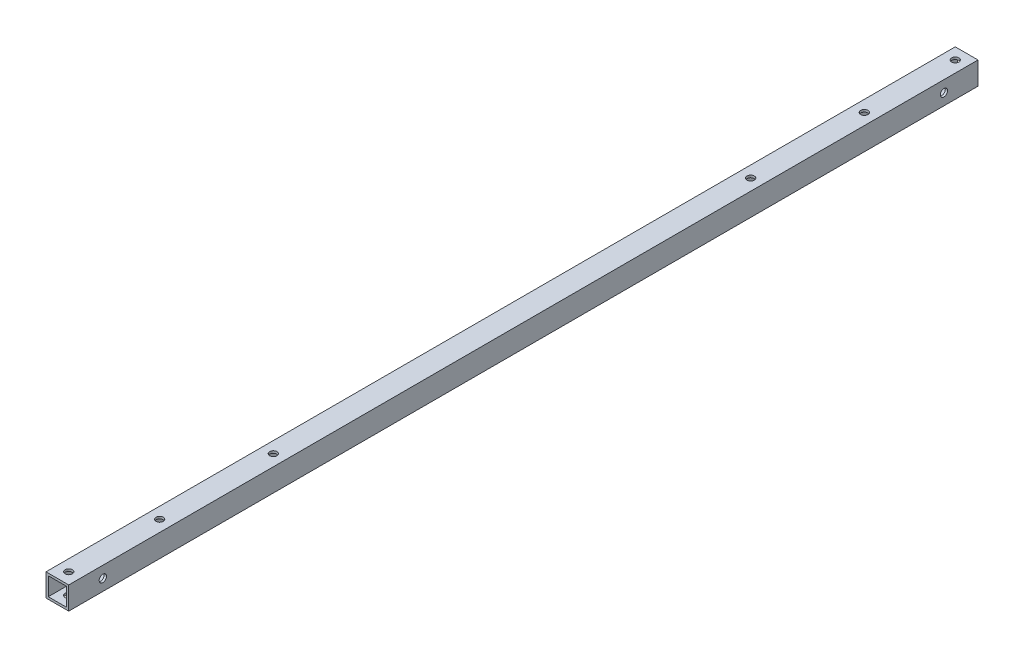
ISO-10303-21;
HEADER;
FILE_DESCRIPTION(('STEP AP214'),'2;1');
FILE_NAME('part.step','',(''),(''),'','','');
FILE_SCHEMA(('AUTOMOTIVE_DESIGN { 1 0 10303 214 1 1 1 1 }'));
ENDSEC;
DATA;
#1=APPLICATION_CONTEXT('core data for automotive mechanical design processes');
#2=APPLICATION_PROTOCOL_DEFINITION('international standard','automotive_design',2000,#1);
#3=PRODUCT_CONTEXT('',#1,'mechanical');
#4=PRODUCT('Part','Part','',(#3));
#5=PRODUCT_RELATED_PRODUCT_CATEGORY('part','',(#4));
#6=PRODUCT_DEFINITION_FORMATION('','',#4);
#7=PRODUCT_DEFINITION_CONTEXT('part definition',#1,'design');
#8=PRODUCT_DEFINITION('design','',#6,#7);
#9=PRODUCT_DEFINITION_SHAPE('','',#8);
#10=(LENGTH_UNIT() NAMED_UNIT(*) SI_UNIT(.MILLI.,.METRE.));
#11=(NAMED_UNIT(*) PLANE_ANGLE_UNIT() SI_UNIT($,.RADIAN.));
#12=(NAMED_UNIT(*) SI_UNIT($,.STERADIAN.) SOLID_ANGLE_UNIT());
#13=UNCERTAINTY_MEASURE_WITH_UNIT(LENGTH_MEASURE(1.E-05),#10,'distance_accuracy_value','');
#14=(GEOMETRIC_REPRESENTATION_CONTEXT(3) GLOBAL_UNCERTAINTY_ASSIGNED_CONTEXT((#13)) GLOBAL_UNIT_ASSIGNED_CONTEXT((#10,
#11,#12)) REPRESENTATION_CONTEXT('',''));
#15=CARTESIAN_POINT('',(0.,0.,0.));
#16=DIRECTION('',(0.,0.,1.));
#17=DIRECTION('',(1.,0.,0.));
#18=AXIS2_PLACEMENT_3D('',#15,#16,#17);
#19=CARTESIAN_POINT('',(0.,0.,400.));
#20=DIRECTION('',(0.,0.,1.));
#21=DIRECTION('',(1.,0.,0.));
#22=AXIS2_PLACEMENT_3D('',#19,#20,#21);
#23=PLANE('',#22);
#24=DIRECTION('',(0.,1.,0.));
#25=VECTOR('',#24,1.);
#26=CARTESIAN_POINT('',(5.00000000000002,-4.99999999999998,400.));
#27=LINE('',#26,#25);
#28=CARTESIAN_POINT('',(5.00000000000002,-4.99999999999998,400.));
#29=VERTEX_POINT('',#28);
#30=CARTESIAN_POINT('',(5.00000000000002,5.,400.));
#31=VERTEX_POINT('',#30);
#32=EDGE_CURVE('E161',#29,#31,#27,.T.);
#33=ORIENTED_EDGE('',*,*,#32,.T.);
#34=DIRECTION('',(-1.,0.,0.));
#35=VECTOR('',#34,1.);
#36=CARTESIAN_POINT('',(-4.99999999999998,5.,400.));
#37=LINE('',#36,#35);
#38=CARTESIAN_POINT('',(-4.99999999999998,5.,400.));
#39=VERTEX_POINT('',#38);
#40=EDGE_CURVE('E164',#31,#39,#37,.T.);
#41=ORIENTED_EDGE('',*,*,#40,.T.);
#42=DIRECTION('',(0.,-1.,0.));
#43=VECTOR('',#42,1.);
#44=CARTESIAN_POINT('',(-4.99999999999998,-4.99999999999998,400.));
#45=LINE('',#44,#43);
#46=CARTESIAN_POINT('',(-4.99999999999998,-4.99999999999998,400.));
#47=VERTEX_POINT('',#46);
#48=EDGE_CURVE('E167',#39,#47,#45,.T.);
#49=ORIENTED_EDGE('',*,*,#48,.T.);
#50=DIRECTION('',(1.,0.,0.));
#51=VECTOR('',#50,1.);
#52=CARTESIAN_POINT('',(-4.99999999999998,-4.99999999999998,400.));
#53=LINE('',#52,#51);
#54=EDGE_CURVE('E169',#47,#29,#53,.T.);
#55=ORIENTED_EDGE('',*,*,#54,.T.);
#56=EDGE_LOOP('',(#33,#41,#49,#55));
#57=FACE_BOUND('',#56,.T.);
#58=DIRECTION('',(-1.,0.,0.));
#59=VECTOR('',#58,1.);
#60=CARTESIAN_POINT('',(0.,4.,400.));
#61=LINE('',#60,#59);
#62=CARTESIAN_POINT('',(4.00000000000002,4.,400.));
#63=VERTEX_POINT('',#62);
#64=CARTESIAN_POINT('',(-3.99999999999998,4.,400.));
#65=VERTEX_POINT('',#64);
#66=EDGE_CURVE('E131',#63,#65,#61,.T.);
#67=ORIENTED_EDGE('',*,*,#66,.F.);
#68=DIRECTION('',(0.,1.,0.));
#69=VECTOR('',#68,1.);
#70=CARTESIAN_POINT('',(4.00000000000002,0.,400.));
#71=LINE('',#70,#69);
#72=CARTESIAN_POINT('',(4.00000000000002,-3.99999999999998,400.));
#73=VERTEX_POINT('',#72);
#74=EDGE_CURVE('E123',#73,#63,#71,.T.);
#75=ORIENTED_EDGE('',*,*,#74,.F.);
#76=DIRECTION('',(1.,0.,0.));
#77=VECTOR('',#76,1.);
#78=CARTESIAN_POINT('',(0.,-3.99999999999998,400.));
#79=LINE('',#78,#77);
#80=CARTESIAN_POINT('',(-3.99999999999998,-3.99999999999998,400.));
#81=VERTEX_POINT('',#80);
#82=EDGE_CURVE('E145',#81,#73,#79,.T.);
#83=ORIENTED_EDGE('',*,*,#82,.F.);
#84=DIRECTION('',(0.,-1.,0.));
#85=VECTOR('',#84,1.);
#86=CARTESIAN_POINT('',(-3.99999999999998,0.,400.));
#87=LINE('',#86,#85);
#88=EDGE_CURVE('E143',#65,#81,#87,.T.);
#89=ORIENTED_EDGE('',*,*,#88,.F.);
#90=EDGE_LOOP('',(#67,#75,#83,#89));
#91=FACE_BOUND('',#90,.T.);
#92=ADVANCED_FACE('F56',(#57,#91),#23,.T.);
#93=CARTESIAN_POINT('',(0.,0.,0.));
#94=DIRECTION('',(0.,0.,1.));
#95=DIRECTION('',(1.,0.,0.));
#96=AXIS2_PLACEMENT_3D('',#93,#94,#95);
#97=PLANE('',#96);
#98=DIRECTION('',(0.,1.,0.));
#99=VECTOR('',#98,1.);
#100=CARTESIAN_POINT('',(5.00000000000002,-4.99999999999998,0.));
#101=LINE('',#100,#99);
#102=CARTESIAN_POINT('',(5.00000000000002,-4.99999999999998,0.));
#103=VERTEX_POINT('',#102);
#104=CARTESIAN_POINT('',(5.00000000000002,5.,0.));
#105=VERTEX_POINT('',#104);
#106=EDGE_CURVE('E139',#103,#105,#101,.T.);
#107=ORIENTED_EDGE('',*,*,#106,.F.);
#108=DIRECTION('',(1.,0.,0.));
#109=VECTOR('',#108,1.);
#110=CARTESIAN_POINT('',(-4.99999999999998,-4.99999999999998,0.));
#111=LINE('',#110,#109);
#112=CARTESIAN_POINT('',(-4.99999999999998,-4.99999999999998,0.));
#113=VERTEX_POINT('',#112);
#114=EDGE_CURVE('E165',#113,#103,#111,.T.);
#115=ORIENTED_EDGE('',*,*,#114,.F.);
#116=DIRECTION('',(0.,-1.,0.));
#117=VECTOR('',#116,1.);
#118=CARTESIAN_POINT('',(-4.99999999999998,-4.99999999999998,0.));
#119=LINE('',#118,#117);
#120=CARTESIAN_POINT('',(-4.99999999999998,5.,0.));
#121=VERTEX_POINT('',#120);
#122=EDGE_CURVE('E176',#121,#113,#119,.T.);
#123=ORIENTED_EDGE('',*,*,#122,.F.);
#124=DIRECTION('',(-1.,0.,0.));
#125=VECTOR('',#124,1.);
#126=CARTESIAN_POINT('',(-4.99999999999998,5.,0.));
#127=LINE('',#126,#125);
#128=EDGE_CURVE('E174',#105,#121,#127,.T.);
#129=ORIENTED_EDGE('',*,*,#128,.F.);
#130=EDGE_LOOP('',(#107,#115,#123,#129));
#131=FACE_BOUND('',#130,.T.);
#132=DIRECTION('',(0.,1.,0.));
#133=VECTOR('',#132,1.);
#134=CARTESIAN_POINT('',(4.00000000000002,0.,0.));
#135=LINE('',#134,#133);
#136=CARTESIAN_POINT('',(4.00000000000002,-3.99999999999998,0.));
#137=VERTEX_POINT('',#136);
#138=CARTESIAN_POINT('',(4.00000000000002,4.,0.));
#139=VERTEX_POINT('',#138);
#140=EDGE_CURVE('E81',#137,#139,#135,.T.);
#141=ORIENTED_EDGE('',*,*,#140,.T.);
#142=DIRECTION('',(-1.,0.,0.));
#143=VECTOR('',#142,1.);
#144=CARTESIAN_POINT('',(0.,4.,0.));
#145=LINE('',#144,#143);
#146=CARTESIAN_POINT('',(-3.99999999999998,4.,0.));
#147=VERTEX_POINT('',#146);
#148=EDGE_CURVE('E138',#139,#147,#145,.T.);
#149=ORIENTED_EDGE('',*,*,#148,.T.);
#150=DIRECTION('',(0.,-1.,0.));
#151=VECTOR('',#150,1.);
#152=CARTESIAN_POINT('',(-3.99999999999998,0.,0.));
#153=LINE('',#152,#151);
#154=CARTESIAN_POINT('',(-3.99999999999998,-3.99999999999998,0.));
#155=VERTEX_POINT('',#154);
#156=EDGE_CURVE('E153',#147,#155,#153,.T.);
#157=ORIENTED_EDGE('',*,*,#156,.T.);
#158=DIRECTION('',(1.,0.,0.));
#159=VECTOR('',#158,1.);
#160=CARTESIAN_POINT('',(0.,-3.99999999999998,0.));
#161=LINE('',#160,#159);
#162=EDGE_CURVE('E132',#155,#137,#161,.T.);
#163=ORIENTED_EDGE('',*,*,#162,.T.);
#164=EDGE_LOOP('',(#141,#149,#157,#163));
#165=FACE_BOUND('',#164,.T.);
#166=ADVANCED_FACE('F321',(#131,#165),#97,.F.);
#167=CARTESIAN_POINT('',(5.00000000000002,-4.99999999999998,400.));
#168=DIRECTION('',(-1.,0.,0.));
#169=DIRECTION('',(0.,0.,1.));
#170=AXIS2_PLACEMENT_3D('',#167,#168,#169);
#171=PLANE('',#170);
#172=CARTESIAN_POINT('',(5.00000000000002,0.,385.));
#173=DIRECTION('',(1.,0.,0.));
#174=DIRECTION('',(0.,0.,-1.));
#175=AXIS2_PLACEMENT_3D('',#172,#173,#174);
#176=CIRCLE('',#175,1.59999999999996);
#177=CARTESIAN_POINT('',(5.00000000000002,0.,383.4));
#178=VERTEX_POINT('',#177);
#179=EDGE_CURVE('E218',#178,#178,#176,.T.);
#180=ORIENTED_EDGE('',*,*,#179,.F.);
#181=EDGE_LOOP('',(#180));
#182=FACE_BOUND('',#181,.T.);
#183=CARTESIAN_POINT('',(5.00000000000002,0.,15.));
#184=DIRECTION('',(1.,0.,0.));
#185=DIRECTION('',(0.,0.,1.));
#186=AXIS2_PLACEMENT_3D('',#183,#184,#185);
#187=CIRCLE('',#186,1.60000000000001);
#188=CARTESIAN_POINT('',(5.00000000000002,0.,16.6));
#189=VERTEX_POINT('',#188);
#190=EDGE_CURVE('E228',#189,#189,#187,.T.);
#191=ORIENTED_EDGE('',*,*,#190,.F.);
#192=EDGE_LOOP('',(#191));
#193=FACE_BOUND('',#192,.T.);
#194=ORIENTED_EDGE('',*,*,#106,.T.);
#195=DIRECTION('',(0.,0.,-1.));
#196=VECTOR('',#195,1.);
#197=CARTESIAN_POINT('',(5.00000000000002,5.,400.));
#198=LINE('',#197,#196);
#199=EDGE_CURVE('E12',#31,#105,#198,.T.);
#200=ORIENTED_EDGE('',*,*,#199,.F.);
#201=ORIENTED_EDGE('',*,*,#32,.F.);
#202=DIRECTION('',(0.,0.,-1.));
#203=VECTOR('',#202,1.);
#204=CARTESIAN_POINT('',(5.00000000000002,-4.99999999999998,400.));
#205=LINE('',#204,#203);
#206=EDGE_CURVE('E171',#29,#103,#205,.T.);
#207=ORIENTED_EDGE('',*,*,#206,.T.);
#208=EDGE_LOOP('',(#194,#200,#201,#207));
#209=FACE_BOUND('',#208,.T.);
#210=ADVANCED_FACE('F58',(#182,#193,#209),#171,.F.);
#211=CARTESIAN_POINT('',(-4.99999999999998,5.,400.));
#212=DIRECTION('',(0.,-1.,0.));
#213=DIRECTION('',(0.,0.,-1.));
#214=AXIS2_PLACEMENT_3D('',#211,#212,#213);
#215=PLANE('',#214);
#216=CARTESIAN_POINT('',(0.,5.,5.));
#217=DIRECTION('',(0.,1.,0.));
#218=DIRECTION('',(0.,0.,-1.));
#219=AXIS2_PLACEMENT_3D('',#216,#217,#218);
#220=CIRCLE('',#219,1.6);
#221=CARTESIAN_POINT('',(0.,5.,3.40000000000001));
#222=VERTEX_POINT('',#221);
#223=EDGE_CURVE('E234',#222,#222,#220,.T.);
#224=ORIENTED_EDGE('',*,*,#223,.F.);
#225=EDGE_LOOP('',(#224));
#226=FACE_BOUND('',#225,.T.);
#227=CARTESIAN_POINT('',(0.,5.,45.));
#228=DIRECTION('',(0.,1.,0.));
#229=DIRECTION('',(0.,0.,-1.));
#230=AXIS2_PLACEMENT_3D('',#227,#228,#229);
#231=CIRCLE('',#230,1.6);
#232=CARTESIAN_POINT('',(0.,5.,43.4));
#233=VERTEX_POINT('',#232);
#234=EDGE_CURVE('E253',#233,#233,#231,.T.);
#235=ORIENTED_EDGE('',*,*,#234,.F.);
#236=EDGE_LOOP('',(#235));
#237=FACE_BOUND('',#236,.T.);
#238=CARTESIAN_POINT('',(0.,5.,305.));
#239=DIRECTION('',(0.,1.,0.));
#240=DIRECTION('',(0.,0.,1.));
#241=AXIS2_PLACEMENT_3D('',#238,#239,#240);
#242=CIRCLE('',#241,1.59999999999999);
#243=CARTESIAN_POINT('',(0.,5.,306.6));
#244=VERTEX_POINT('',#243);
#245=EDGE_CURVE('E238',#244,#244,#242,.T.);
#246=ORIENTED_EDGE('',*,*,#245,.F.);
#247=EDGE_LOOP('',(#246));
#248=FACE_BOUND('',#247,.T.);
#249=CARTESIAN_POINT('',(0.,5.,95.));
#250=DIRECTION('',(0.,1.,0.));
#251=DIRECTION('',(0.,0.,-1.));
#252=AXIS2_PLACEMENT_3D('',#249,#250,#251);
#253=CIRCLE('',#252,1.6);
#254=CARTESIAN_POINT('',(0.,5.,93.4));
#255=VERTEX_POINT('',#254);
#256=EDGE_CURVE('E239',#255,#255,#253,.T.);
#257=ORIENTED_EDGE('',*,*,#256,.F.);
#258=EDGE_LOOP('',(#257));
#259=FACE_BOUND('',#258,.T.);
#260=CARTESIAN_POINT('',(0.,5.,395.));
#261=DIRECTION('',(0.,1.,0.));
#262=DIRECTION('',(0.,0.,1.));
#263=AXIS2_PLACEMENT_3D('',#260,#261,#262);
#264=CIRCLE('',#263,1.6);
#265=CARTESIAN_POINT('',(0.,5.,396.6));
#266=VERTEX_POINT('',#265);
#267=EDGE_CURVE('E245',#266,#266,#264,.T.);
#268=ORIENTED_EDGE('',*,*,#267,.F.);
#269=EDGE_LOOP('',(#268));
#270=FACE_BOUND('',#269,.T.);
#271=CARTESIAN_POINT('',(0.,5.,355.));
#272=DIRECTION('',(0.,1.,0.));
#273=DIRECTION('',(0.,0.,1.));
#274=AXIS2_PLACEMENT_3D('',#271,#272,#273);
#275=CIRCLE('',#274,1.59999999999999);
#276=CARTESIAN_POINT('',(0.,5.,356.6));
#277=VERTEX_POINT('',#276);
#278=EDGE_CURVE('E252',#277,#277,#275,.T.);
#279=ORIENTED_EDGE('',*,*,#278,.F.);
#280=EDGE_LOOP('',(#279));
#281=FACE_BOUND('',#280,.T.);
#282=ORIENTED_EDGE('',*,*,#128,.T.);
#283=DIRECTION('',(0.,0.,-1.));
#284=VECTOR('',#283,1.);
#285=CARTESIAN_POINT('',(-4.99999999999998,5.,400.));
#286=LINE('',#285,#284);
#287=EDGE_CURVE('E65',#39,#121,#286,.T.);
#288=ORIENTED_EDGE('',*,*,#287,.F.);
#289=ORIENTED_EDGE('',*,*,#40,.F.);
#290=ORIENTED_EDGE('',*,*,#199,.T.);
#291=EDGE_LOOP('',(#282,#288,#289,#290));
#292=FACE_BOUND('',#291,.T.);
#293=ADVANCED_FACE('F307',(#226,#237,#248,#259,#270,#281,#292),#215,.F.);
#294=CARTESIAN_POINT('',(-4.99999999999998,-4.99999999999998,400.));
#295=DIRECTION('',(1.,0.,0.));
#296=DIRECTION('',(0.,0.,-1.));
#297=AXIS2_PLACEMENT_3D('',#294,#295,#296);
#298=PLANE('',#297);
#299=CARTESIAN_POINT('',(-4.99999999999998,0.,385.));
#300=DIRECTION('',(1.,0.,0.));
#301=DIRECTION('',(0.,0.,-1.));
#302=AXIS2_PLACEMENT_3D('',#299,#300,#301);
#303=CIRCLE('',#302,1.59999999999996);
#304=CARTESIAN_POINT('',(-4.99999999999998,0.,383.4));
#305=VERTEX_POINT('',#304);
#306=EDGE_CURVE('E212',#305,#305,#303,.T.);
#307=ORIENTED_EDGE('',*,*,#306,.T.);
#308=EDGE_LOOP('',(#307));
#309=FACE_BOUND('',#308,.T.);
#310=CARTESIAN_POINT('',(-4.99999999999998,0.,15.));
#311=DIRECTION('',(1.,0.,0.));
#312=DIRECTION('',(0.,0.,1.));
#313=AXIS2_PLACEMENT_3D('',#310,#311,#312);
#314=CIRCLE('',#313,1.60000000000001);
#315=CARTESIAN_POINT('',(-4.99999999999998,0.,16.6));
#316=VERTEX_POINT('',#315);
#317=EDGE_CURVE('E223',#316,#316,#314,.T.);
#318=ORIENTED_EDGE('',*,*,#317,.T.);
#319=EDGE_LOOP('',(#318));
#320=FACE_BOUND('',#319,.T.);
#321=ORIENTED_EDGE('',*,*,#122,.T.);
#322=DIRECTION('',(0.,0.,-1.));
#323=VECTOR('',#322,1.);
#324=CARTESIAN_POINT('',(-4.99999999999998,-4.99999999999998,400.));
#325=LINE('',#324,#323);
#326=EDGE_CURVE('E181',#47,#113,#325,.T.);
#327=ORIENTED_EDGE('',*,*,#326,.F.);
#328=ORIENTED_EDGE('',*,*,#48,.F.);
#329=ORIENTED_EDGE('',*,*,#287,.T.);
#330=EDGE_LOOP('',(#321,#327,#328,#329));
#331=FACE_BOUND('',#330,.T.);
#332=ADVANCED_FACE('F310',(#309,#320,#331),#298,.F.);
#333=CARTESIAN_POINT('',(-4.99999999999998,-4.99999999999998,400.));
#334=DIRECTION('',(0.,1.,0.));
#335=DIRECTION('',(0.,0.,1.));
#336=AXIS2_PLACEMENT_3D('',#333,#334,#335);
#337=PLANE('',#336);
#338=CARTESIAN_POINT('',(0.,-4.99999999999998,5.));
#339=DIRECTION('',(0.,1.,0.));
#340=DIRECTION('',(0.,0.,-1.));
#341=AXIS2_PLACEMENT_3D('',#338,#339,#340);
#342=CIRCLE('',#341,1.6);
#343=CARTESIAN_POINT('',(0.,-4.99999999999998,3.40000000000001));
#344=VERTEX_POINT('',#343);
#345=EDGE_CURVE('E248',#344,#344,#342,.T.);
#346=ORIENTED_EDGE('',*,*,#345,.T.);
#347=EDGE_LOOP('',(#346));
#348=FACE_BOUND('',#347,.T.);
#349=CARTESIAN_POINT('',(0.,-4.99999999999998,45.));
#350=DIRECTION('',(0.,1.,0.));
#351=DIRECTION('',(0.,0.,-1.));
#352=AXIS2_PLACEMENT_3D('',#349,#350,#351);
#353=CIRCLE('',#352,1.6);
#354=CARTESIAN_POINT('',(0.,-4.99999999999998,43.4));
#355=VERTEX_POINT('',#354);
#356=EDGE_CURVE('E249',#355,#355,#353,.T.);
#357=ORIENTED_EDGE('',*,*,#356,.T.);
#358=EDGE_LOOP('',(#357));
#359=FACE_BOUND('',#358,.T.);
#360=CARTESIAN_POINT('',(0.,-4.99999999999998,305.));
#361=DIRECTION('',(0.,1.,0.));
#362=DIRECTION('',(0.,0.,1.));
#363=AXIS2_PLACEMENT_3D('',#360,#361,#362);
#364=CIRCLE('',#363,1.59999999999999);
#365=CARTESIAN_POINT('',(0.,-4.99999999999998,306.6));
#366=VERTEX_POINT('',#365);
#367=EDGE_CURVE('E256',#366,#366,#364,.T.);
#368=ORIENTED_EDGE('',*,*,#367,.T.);
#369=EDGE_LOOP('',(#368));
#370=FACE_BOUND('',#369,.T.);
#371=CARTESIAN_POINT('',(0.,-4.99999999999998,95.));
#372=DIRECTION('',(0.,1.,0.));
#373=DIRECTION('',(0.,0.,-1.));
#374=AXIS2_PLACEMENT_3D('',#371,#372,#373);
#375=CIRCLE('',#374,1.6);
#376=CARTESIAN_POINT('',(0.,-4.99999999999998,93.4));
#377=VERTEX_POINT('',#376);
#378=EDGE_CURVE('E235',#377,#377,#375,.T.);
#379=ORIENTED_EDGE('',*,*,#378,.T.);
#380=EDGE_LOOP('',(#379));
#381=FACE_BOUND('',#380,.T.);
#382=CARTESIAN_POINT('',(0.,-4.99999999999998,395.));
#383=DIRECTION('',(0.,1.,0.));
#384=DIRECTION('',(0.,0.,1.));
#385=AXIS2_PLACEMENT_3D('',#382,#383,#384);
#386=CIRCLE('',#385,1.6);
#387=CARTESIAN_POINT('',(0.,-4.99999999999998,396.6));
#388=VERTEX_POINT('',#387);
#389=EDGE_CURVE('E242',#388,#388,#386,.T.);
#390=ORIENTED_EDGE('',*,*,#389,.T.);
#391=EDGE_LOOP('',(#390));
#392=FACE_BOUND('',#391,.T.);
#393=CARTESIAN_POINT('',(0.,-4.99999999999998,355.));
#394=DIRECTION('',(0.,1.,0.));
#395=DIRECTION('',(0.,0.,1.));
#396=AXIS2_PLACEMENT_3D('',#393,#394,#395);
#397=CIRCLE('',#396,1.59999999999999);
#398=CARTESIAN_POINT('',(0.,-4.99999999999998,356.6));
#399=VERTEX_POINT('',#398);
#400=EDGE_CURVE('E190',#399,#399,#397,.T.);
#401=ORIENTED_EDGE('',*,*,#400,.T.);
#402=EDGE_LOOP('',(#401));
#403=FACE_BOUND('',#402,.T.);
#404=ORIENTED_EDGE('',*,*,#114,.T.);
#405=ORIENTED_EDGE('',*,*,#206,.F.);
#406=ORIENTED_EDGE('',*,*,#54,.F.);
#407=ORIENTED_EDGE('',*,*,#326,.T.);
#408=EDGE_LOOP('',(#404,#405,#406,#407));
#409=FACE_BOUND('',#408,.T.);
#410=ADVANCED_FACE('F325',(#348,#359,#370,#381,#392,#403,#409),#337,.F.);
#411=CARTESIAN_POINT('',(4.00000000000002,0.,400.));
#412=DIRECTION('',(-1.,0.,0.));
#413=DIRECTION('',(0.,0.,1.));
#414=AXIS2_PLACEMENT_3D('',#411,#412,#413);
#415=PLANE('',#414);
#416=CARTESIAN_POINT('',(4.00000000000002,0.,385.));
#417=DIRECTION('',(-1.,0.,0.));
#418=DIRECTION('',(0.,0.,1.));
#419=AXIS2_PLACEMENT_3D('',#416,#417,#418);
#420=CIRCLE('',#419,1.59999999999996);
#421=CARTESIAN_POINT('',(4.00000000000002,0.,386.6));
#422=VERTEX_POINT('',#421);
#423=EDGE_CURVE('E231',#422,#422,#420,.T.);
#424=ORIENTED_EDGE('',*,*,#423,.F.);
#425=EDGE_LOOP('',(#424));
#426=FACE_BOUND('',#425,.T.);
#427=CARTESIAN_POINT('',(4.00000000000002,0.,15.));
#428=DIRECTION('',(-1.,0.,0.));
#429=DIRECTION('',(0.,0.,1.));
#430=AXIS2_PLACEMENT_3D('',#427,#428,#429);
#431=CIRCLE('',#430,1.60000000000001);
#432=CARTESIAN_POINT('',(4.00000000000002,0.,16.6));
#433=VERTEX_POINT('',#432);
#434=EDGE_CURVE('E211',#433,#433,#431,.T.);
#435=ORIENTED_EDGE('',*,*,#434,.F.);
#436=EDGE_LOOP('',(#435));
#437=FACE_BOUND('',#436,.T.);
#438=ORIENTED_EDGE('',*,*,#140,.F.);
#439=DIRECTION('',(0.,0.,-1.));
#440=VECTOR('',#439,1.);
#441=CARTESIAN_POINT('',(4.00000000000002,-3.99999999999998,400.));
#442=LINE('',#441,#440);
#443=EDGE_CURVE('E127',#73,#137,#442,.T.);
#444=ORIENTED_EDGE('',*,*,#443,.F.);
#445=ORIENTED_EDGE('',*,*,#74,.T.);
#446=DIRECTION('',(0.,0.,-1.));
#447=VECTOR('',#446,1.);
#448=CARTESIAN_POINT('',(4.00000000000002,4.,400.));
#449=LINE('',#448,#447);
#450=EDGE_CURVE('E126',#63,#139,#449,.T.);
#451=ORIENTED_EDGE('',*,*,#450,.T.);
#452=EDGE_LOOP('',(#438,#444,#445,#451));
#453=FACE_BOUND('',#452,.T.);
#454=ADVANCED_FACE('F125',(#426,#437,#453),#415,.T.);
#455=CARTESIAN_POINT('',(0.,4.,400.));
#456=DIRECTION('',(0.,-1.,0.));
#457=DIRECTION('',(0.,0.,-1.));
#458=AXIS2_PLACEMENT_3D('',#455,#456,#457);
#459=PLANE('',#458);
#460=CARTESIAN_POINT('',(0.,4.,5.));
#461=DIRECTION('',(0.,-1.,0.));
#462=DIRECTION('',(0.,0.,-1.));
#463=AXIS2_PLACEMENT_3D('',#460,#461,#462);
#464=CIRCLE('',#463,1.6);
#465=CARTESIAN_POINT('',(0.,4.,3.40000000000001));
#466=VERTEX_POINT('',#465);
#467=EDGE_CURVE('E151',#466,#466,#464,.T.);
#468=ORIENTED_EDGE('',*,*,#467,.F.);
#469=EDGE_LOOP('',(#468));
#470=FACE_BOUND('',#469,.T.);
#471=CARTESIAN_POINT('',(0.,4.,45.));
#472=DIRECTION('',(0.,-1.,0.));
#473=DIRECTION('',(0.,0.,-1.));
#474=AXIS2_PLACEMENT_3D('',#471,#472,#473);
#475=CIRCLE('',#474,1.6);
#476=CARTESIAN_POINT('',(0.,4.,43.4));
#477=VERTEX_POINT('',#476);
#478=EDGE_CURVE('E206',#477,#477,#475,.T.);
#479=ORIENTED_EDGE('',*,*,#478,.F.);
#480=EDGE_LOOP('',(#479));
#481=FACE_BOUND('',#480,.T.);
#482=CARTESIAN_POINT('',(0.,4.,305.));
#483=DIRECTION('',(0.,-1.,0.));
#484=DIRECTION('',(0.,0.,-1.));
#485=AXIS2_PLACEMENT_3D('',#482,#483,#484);
#486=CIRCLE('',#485,1.59999999999999);
#487=CARTESIAN_POINT('',(0.,4.,303.4));
#488=VERTEX_POINT('',#487);
#489=EDGE_CURVE('E202',#488,#488,#486,.T.);
#490=ORIENTED_EDGE('',*,*,#489,.F.);
#491=EDGE_LOOP('',(#490));
#492=FACE_BOUND('',#491,.T.);
#493=CARTESIAN_POINT('',(0.,4.,95.));
#494=DIRECTION('',(0.,-1.,0.));
#495=DIRECTION('',(0.,0.,-1.));
#496=AXIS2_PLACEMENT_3D('',#493,#494,#495);
#497=CIRCLE('',#496,1.6);
#498=CARTESIAN_POINT('',(0.,4.,93.4));
#499=VERTEX_POINT('',#498);
#500=EDGE_CURVE('E198',#499,#499,#497,.T.);
#501=ORIENTED_EDGE('',*,*,#500,.F.);
#502=EDGE_LOOP('',(#501));
#503=FACE_BOUND('',#502,.T.);
#504=CARTESIAN_POINT('',(0.,4.,395.));
#505=DIRECTION('',(0.,-1.,0.));
#506=DIRECTION('',(0.,0.,-1.));
#507=AXIS2_PLACEMENT_3D('',#504,#505,#506);
#508=CIRCLE('',#507,1.6);
#509=CARTESIAN_POINT('',(0.,4.,393.4));
#510=VERTEX_POINT('',#509);
#511=EDGE_CURVE('E194',#510,#510,#508,.T.);
#512=ORIENTED_EDGE('',*,*,#511,.F.);
#513=EDGE_LOOP('',(#512));
#514=FACE_BOUND('',#513,.T.);
#515=CARTESIAN_POINT('',(0.,4.,355.));
#516=DIRECTION('',(0.,-1.,0.));
#517=DIRECTION('',(0.,0.,-1.));
#518=AXIS2_PLACEMENT_3D('',#515,#516,#517);
#519=CIRCLE('',#518,1.59999999999999);
#520=CARTESIAN_POINT('',(0.,4.,353.4));
#521=VERTEX_POINT('',#520);
#522=EDGE_CURVE('E189',#521,#521,#519,.T.);
#523=ORIENTED_EDGE('',*,*,#522,.F.);
#524=EDGE_LOOP('',(#523));
#525=FACE_BOUND('',#524,.T.);
#526=ORIENTED_EDGE('',*,*,#148,.F.);
#527=ORIENTED_EDGE('',*,*,#450,.F.);
#528=ORIENTED_EDGE('',*,*,#66,.T.);
#529=DIRECTION('',(0.,0.,-1.));
#530=VECTOR('',#529,1.);
#531=CARTESIAN_POINT('',(-3.99999999999998,4.,400.));
#532=LINE('',#531,#530);
#533=EDGE_CURVE('E140',#65,#147,#532,.T.);
#534=ORIENTED_EDGE('',*,*,#533,.T.);
#535=EDGE_LOOP('',(#526,#527,#528,#534));
#536=FACE_BOUND('',#535,.T.);
#537=ADVANCED_FACE('F135',(#470,#481,#492,#503,#514,#525,#536),#459,.T.);
#538=CARTESIAN_POINT('',(-3.99999999999998,0.,400.));
#539=DIRECTION('',(1.,0.,0.));
#540=DIRECTION('',(0.,0.,-1.));
#541=AXIS2_PLACEMENT_3D('',#538,#539,#540);
#542=PLANE('',#541);
#543=CARTESIAN_POINT('',(-3.99999999999998,0.,385.));
#544=DIRECTION('',(1.,0.,0.));
#545=DIRECTION('',(0.,0.,-1.));
#546=AXIS2_PLACEMENT_3D('',#543,#544,#545);
#547=CIRCLE('',#546,1.59999999999996);
#548=CARTESIAN_POINT('',(-3.99999999999998,0.,383.4));
#549=VERTEX_POINT('',#548);
#550=EDGE_CURVE('E60',#549,#549,#547,.T.);
#551=ORIENTED_EDGE('',*,*,#550,.F.);
#552=EDGE_LOOP('',(#551));
#553=FACE_BOUND('',#552,.T.);
#554=CARTESIAN_POINT('',(-3.99999999999998,0.,15.));
#555=DIRECTION('',(1.,0.,0.));
#556=DIRECTION('',(0.,0.,-1.));
#557=AXIS2_PLACEMENT_3D('',#554,#555,#556);
#558=CIRCLE('',#557,1.60000000000001);
#559=CARTESIAN_POINT('',(-3.99999999999998,0.,13.4));
#560=VERTEX_POINT('',#559);
#561=EDGE_CURVE('E209',#560,#560,#558,.T.);
#562=ORIENTED_EDGE('',*,*,#561,.F.);
#563=EDGE_LOOP('',(#562));
#564=FACE_BOUND('',#563,.T.);
#565=ORIENTED_EDGE('',*,*,#156,.F.);
#566=ORIENTED_EDGE('',*,*,#533,.F.);
#567=ORIENTED_EDGE('',*,*,#88,.T.);
#568=DIRECTION('',(0.,0.,-1.));
#569=VECTOR('',#568,1.);
#570=CARTESIAN_POINT('',(-3.99999999999998,-3.99999999999998,400.));
#571=LINE('',#570,#569);
#572=EDGE_CURVE('E73',#81,#155,#571,.T.);
#573=ORIENTED_EDGE('',*,*,#572,.T.);
#574=EDGE_LOOP('',(#565,#566,#567,#573));
#575=FACE_BOUND('',#574,.T.);
#576=ADVANCED_FACE('F286',(#553,#564,#575),#542,.T.);
#577=CARTESIAN_POINT('',(0.,-3.99999999999998,400.));
#578=DIRECTION('',(0.,1.,0.));
#579=DIRECTION('',(0.,0.,1.));
#580=AXIS2_PLACEMENT_3D('',#577,#578,#579);
#581=PLANE('',#580);
#582=CARTESIAN_POINT('',(0.,-3.99999999999998,5.));
#583=DIRECTION('',(0.,1.,0.));
#584=DIRECTION('',(0.,0.,1.));
#585=AXIS2_PLACEMENT_3D('',#582,#583,#584);
#586=CIRCLE('',#585,1.6);
#587=CARTESIAN_POINT('',(0.,-3.99999999999998,6.6));
#588=VERTEX_POINT('',#587);
#589=EDGE_CURVE('E207',#588,#588,#586,.T.);
#590=ORIENTED_EDGE('',*,*,#589,.F.);
#591=EDGE_LOOP('',(#590));
#592=FACE_BOUND('',#591,.T.);
#593=CARTESIAN_POINT('',(0.,-3.99999999999998,45.));
#594=DIRECTION('',(0.,1.,0.));
#595=DIRECTION('',(0.,0.,1.));
#596=AXIS2_PLACEMENT_3D('',#593,#594,#595);
#597=CIRCLE('',#596,1.6);
#598=CARTESIAN_POINT('',(0.,-3.99999999999998,46.6));
#599=VERTEX_POINT('',#598);
#600=EDGE_CURVE('E203',#599,#599,#597,.T.);
#601=ORIENTED_EDGE('',*,*,#600,.F.);
#602=EDGE_LOOP('',(#601));
#603=FACE_BOUND('',#602,.T.);
#604=CARTESIAN_POINT('',(0.,-3.99999999999998,305.));
#605=DIRECTION('',(0.,1.,0.));
#606=DIRECTION('',(0.,0.,1.));
#607=AXIS2_PLACEMENT_3D('',#604,#605,#606);
#608=CIRCLE('',#607,1.59999999999999);
#609=CARTESIAN_POINT('',(0.,-3.99999999999998,306.6));
#610=VERTEX_POINT('',#609);
#611=EDGE_CURVE('E199',#610,#610,#608,.T.);
#612=ORIENTED_EDGE('',*,*,#611,.F.);
#613=EDGE_LOOP('',(#612));
#614=FACE_BOUND('',#613,.T.);
#615=CARTESIAN_POINT('',(0.,-3.99999999999998,95.));
#616=DIRECTION('',(0.,1.,0.));
#617=DIRECTION('',(0.,0.,1.));
#618=AXIS2_PLACEMENT_3D('',#615,#616,#617);
#619=CIRCLE('',#618,1.6);
#620=CARTESIAN_POINT('',(0.,-3.99999999999998,96.6));
#621=VERTEX_POINT('',#620);
#622=EDGE_CURVE('E195',#621,#621,#619,.T.);
#623=ORIENTED_EDGE('',*,*,#622,.F.);
#624=EDGE_LOOP('',(#623));
#625=FACE_BOUND('',#624,.T.);
#626=CARTESIAN_POINT('',(0.,-3.99999999999998,395.));
#627=DIRECTION('',(0.,1.,0.));
#628=DIRECTION('',(0.,0.,1.));
#629=AXIS2_PLACEMENT_3D('',#626,#627,#628);
#630=CIRCLE('',#629,1.6);
#631=CARTESIAN_POINT('',(0.,-3.99999999999998,396.6));
#632=VERTEX_POINT('',#631);
#633=EDGE_CURVE('E191',#632,#632,#630,.T.);
#634=ORIENTED_EDGE('',*,*,#633,.F.);
#635=EDGE_LOOP('',(#634));
#636=FACE_BOUND('',#635,.T.);
#637=CARTESIAN_POINT('',(0.,-3.99999999999998,355.));
#638=DIRECTION('',(0.,1.,0.));
#639=DIRECTION('',(0.,0.,1.));
#640=AXIS2_PLACEMENT_3D('',#637,#638,#639);
#641=CIRCLE('',#640,1.59999999999999);
#642=CARTESIAN_POINT('',(0.,-3.99999999999998,356.6));
#643=VERTEX_POINT('',#642);
#644=EDGE_CURVE('E186',#643,#643,#641,.T.);
#645=ORIENTED_EDGE('',*,*,#644,.F.);
#646=EDGE_LOOP('',(#645));
#647=FACE_BOUND('',#646,.T.);
#648=ORIENTED_EDGE('',*,*,#162,.F.);
#649=ORIENTED_EDGE('',*,*,#572,.F.);
#650=ORIENTED_EDGE('',*,*,#82,.T.);
#651=ORIENTED_EDGE('',*,*,#443,.T.);
#652=EDGE_LOOP('',(#648,#649,#650,#651));
#653=FACE_BOUND('',#652,.T.);
#654=ADVANCED_FACE('F409',(#592,#603,#614,#625,#636,#647,#653),#581,.T.);
#655=CARTESIAN_POINT('',(0.,-4.99999999999998,355.));
#656=DIRECTION('',(0.,1.,0.));
#657=DIRECTION('',(0.,0.,1.));
#658=AXIS2_PLACEMENT_3D('',#655,#656,#657);
#659=CYLINDRICAL_SURFACE('',#658,1.59999999999999);
#660=ORIENTED_EDGE('',*,*,#644,.T.);
#661=EDGE_LOOP('',(#660));
#662=FACE_BOUND('',#661,.T.);
#663=ORIENTED_EDGE('',*,*,#400,.F.);
#664=EDGE_LOOP('',(#663));
#665=FACE_BOUND('',#664,.T.);
#666=ADVANCED_FACE('F304',(#662,#665),#659,.F.);
#667=CARTESIAN_POINT('',(0.,-4.99999999999998,395.));
#668=DIRECTION('',(0.,1.,0.));
#669=DIRECTION('',(0.,0.,1.));
#670=AXIS2_PLACEMENT_3D('',#667,#668,#669);
#671=CYLINDRICAL_SURFACE('',#670,1.6);
#672=ORIENTED_EDGE('',*,*,#633,.T.);
#673=EDGE_LOOP('',(#672));
#674=FACE_BOUND('',#673,.T.);
#675=ORIENTED_EDGE('',*,*,#389,.F.);
#676=EDGE_LOOP('',(#675));
#677=FACE_BOUND('',#676,.T.);
#678=ADVANCED_FACE('F423',(#674,#677),#671,.F.);
#679=CARTESIAN_POINT('',(0.,-4.99999999999998,95.));
#680=DIRECTION('',(0.,1.,0.));
#681=DIRECTION('',(0.,0.,1.));
#682=AXIS2_PLACEMENT_3D('',#679,#680,#681);
#683=CYLINDRICAL_SURFACE('',#682,1.6);
#684=ORIENTED_EDGE('',*,*,#622,.T.);
#685=EDGE_LOOP('',(#684));
#686=FACE_BOUND('',#685,.T.);
#687=ORIENTED_EDGE('',*,*,#378,.F.);
#688=EDGE_LOOP('',(#687));
#689=FACE_BOUND('',#688,.T.);
#690=ADVANCED_FACE('F432',(#686,#689),#683,.F.);
#691=CARTESIAN_POINT('',(0.,-4.99999999999998,305.));
#692=DIRECTION('',(0.,1.,0.));
#693=DIRECTION('',(0.,0.,1.));
#694=AXIS2_PLACEMENT_3D('',#691,#692,#693);
#695=CYLINDRICAL_SURFACE('',#694,1.59999999999999);
#696=ORIENTED_EDGE('',*,*,#611,.T.);
#697=EDGE_LOOP('',(#696));
#698=FACE_BOUND('',#697,.T.);
#699=ORIENTED_EDGE('',*,*,#367,.F.);
#700=EDGE_LOOP('',(#699));
#701=FACE_BOUND('',#700,.T.);
#702=ADVANCED_FACE('F442',(#698,#701),#695,.F.);
#703=CARTESIAN_POINT('',(0.,-4.99999999999998,45.));
#704=DIRECTION('',(0.,1.,0.));
#705=DIRECTION('',(0.,0.,1.));
#706=AXIS2_PLACEMENT_3D('',#703,#704,#705);
#707=CYLINDRICAL_SURFACE('',#706,1.6);
#708=ORIENTED_EDGE('',*,*,#600,.T.);
#709=EDGE_LOOP('',(#708));
#710=FACE_BOUND('',#709,.T.);
#711=ORIENTED_EDGE('',*,*,#356,.F.);
#712=EDGE_LOOP('',(#711));
#713=FACE_BOUND('',#712,.T.);
#714=ADVANCED_FACE('F452',(#710,#713),#707,.F.);
#715=CARTESIAN_POINT('',(0.,-4.99999999999998,5.));
#716=DIRECTION('',(0.,1.,0.));
#717=DIRECTION('',(0.,0.,1.));
#718=AXIS2_PLACEMENT_3D('',#715,#716,#717);
#719=CYLINDRICAL_SURFACE('',#718,1.6);
#720=ORIENTED_EDGE('',*,*,#589,.T.);
#721=EDGE_LOOP('',(#720));
#722=FACE_BOUND('',#721,.T.);
#723=ORIENTED_EDGE('',*,*,#345,.F.);
#724=EDGE_LOOP('',(#723));
#725=FACE_BOUND('',#724,.T.);
#726=ADVANCED_FACE('F302',(#722,#725),#719,.F.);
#727=ORIENTED_EDGE('',*,*,#522,.T.);
#728=EDGE_LOOP('',(#727));
#729=FACE_BOUND('',#728,.T.);
#730=ORIENTED_EDGE('',*,*,#278,.T.);
#731=EDGE_LOOP('',(#730));
#732=FACE_BOUND('',#731,.T.);
#733=ADVANCED_FACE('F298',(#729,#732),#659,.F.);
#734=ORIENTED_EDGE('',*,*,#511,.T.);
#735=EDGE_LOOP('',(#734));
#736=FACE_BOUND('',#735,.T.);
#737=ORIENTED_EDGE('',*,*,#267,.T.);
#738=EDGE_LOOP('',(#737));
#739=FACE_BOUND('',#738,.T.);
#740=ADVANCED_FACE('F301',(#736,#739),#671,.F.);
#741=ORIENTED_EDGE('',*,*,#500,.T.);
#742=EDGE_LOOP('',(#741));
#743=FACE_BOUND('',#742,.T.);
#744=ORIENTED_EDGE('',*,*,#256,.T.);
#745=EDGE_LOOP('',(#744));
#746=FACE_BOUND('',#745,.T.);
#747=ADVANCED_FACE('F444',(#743,#746),#683,.F.);
#748=ORIENTED_EDGE('',*,*,#489,.T.);
#749=EDGE_LOOP('',(#748));
#750=FACE_BOUND('',#749,.T.);
#751=ORIENTED_EDGE('',*,*,#245,.T.);
#752=EDGE_LOOP('',(#751));
#753=FACE_BOUND('',#752,.T.);
#754=ADVANCED_FACE('F455',(#750,#753),#695,.F.);
#755=ORIENTED_EDGE('',*,*,#478,.T.);
#756=EDGE_LOOP('',(#755));
#757=FACE_BOUND('',#756,.T.);
#758=ORIENTED_EDGE('',*,*,#234,.T.);
#759=EDGE_LOOP('',(#758));
#760=FACE_BOUND('',#759,.T.);
#761=ADVANCED_FACE('F359',(#757,#760),#707,.F.);
#762=ORIENTED_EDGE('',*,*,#467,.T.);
#763=EDGE_LOOP('',(#762));
#764=FACE_BOUND('',#763,.T.);
#765=ORIENTED_EDGE('',*,*,#223,.T.);
#766=EDGE_LOOP('',(#765));
#767=FACE_BOUND('',#766,.T.);
#768=ADVANCED_FACE('F281',(#764,#767),#719,.F.);
#769=CARTESIAN_POINT('',(-4.99999999999998,0.,15.));
#770=DIRECTION('',(1.,0.,0.));
#771=DIRECTION('',(0.,0.,-1.));
#772=AXIS2_PLACEMENT_3D('',#769,#770,#771);
#773=CYLINDRICAL_SURFACE('',#772,1.60000000000001);
#774=ORIENTED_EDGE('',*,*,#561,.T.);
#775=EDGE_LOOP('',(#774));
#776=FACE_BOUND('',#775,.T.);
#777=ORIENTED_EDGE('',*,*,#317,.F.);
#778=EDGE_LOOP('',(#777));
#779=FACE_BOUND('',#778,.T.);
#780=ADVANCED_FACE('F347',(#776,#779),#773,.F.);
#781=CARTESIAN_POINT('',(-4.99999999999998,0.,385.));
#782=DIRECTION('',(1.,0.,0.));
#783=DIRECTION('',(0.,0.,-1.));
#784=AXIS2_PLACEMENT_3D('',#781,#782,#783);
#785=CYLINDRICAL_SURFACE('',#784,1.59999999999996);
#786=ORIENTED_EDGE('',*,*,#550,.T.);
#787=EDGE_LOOP('',(#786));
#788=FACE_BOUND('',#787,.T.);
#789=ORIENTED_EDGE('',*,*,#306,.F.);
#790=EDGE_LOOP('',(#789));
#791=FACE_BOUND('',#790,.T.);
#792=ADVANCED_FACE('F349',(#788,#791),#785,.F.);
#793=ORIENTED_EDGE('',*,*,#434,.T.);
#794=EDGE_LOOP('',(#793));
#795=FACE_BOUND('',#794,.T.);
#796=ORIENTED_EDGE('',*,*,#190,.T.);
#797=EDGE_LOOP('',(#796));
#798=FACE_BOUND('',#797,.T.);
#799=ADVANCED_FACE('F351',(#795,#798),#773,.F.);
#800=ORIENTED_EDGE('',*,*,#423,.T.);
#801=EDGE_LOOP('',(#800));
#802=FACE_BOUND('',#801,.T.);
#803=ORIENTED_EDGE('',*,*,#179,.T.);
#804=EDGE_LOOP('',(#803));
#805=FACE_BOUND('',#804,.T.);
#806=ADVANCED_FACE('F358',(#802,#805),#785,.F.);
#807=CLOSED_SHELL('',(#92,#166,#210,#293,#332,#410,#454,#537,#576,#654,#666,#678,#690,#702,#714,
#726,#733,#740,#747,#754,#761,#768,#780,#792,#799,#806));
#808=MANIFOLD_SOLID_BREP('B2',#807);
#809=ADVANCED_BREP_SHAPE_REPRESENTATION('',(#18,#808),#14);
#810=SHAPE_DEFINITION_REPRESENTATION(#9,#809);
ENDSEC;
END-ISO-10303-21;
